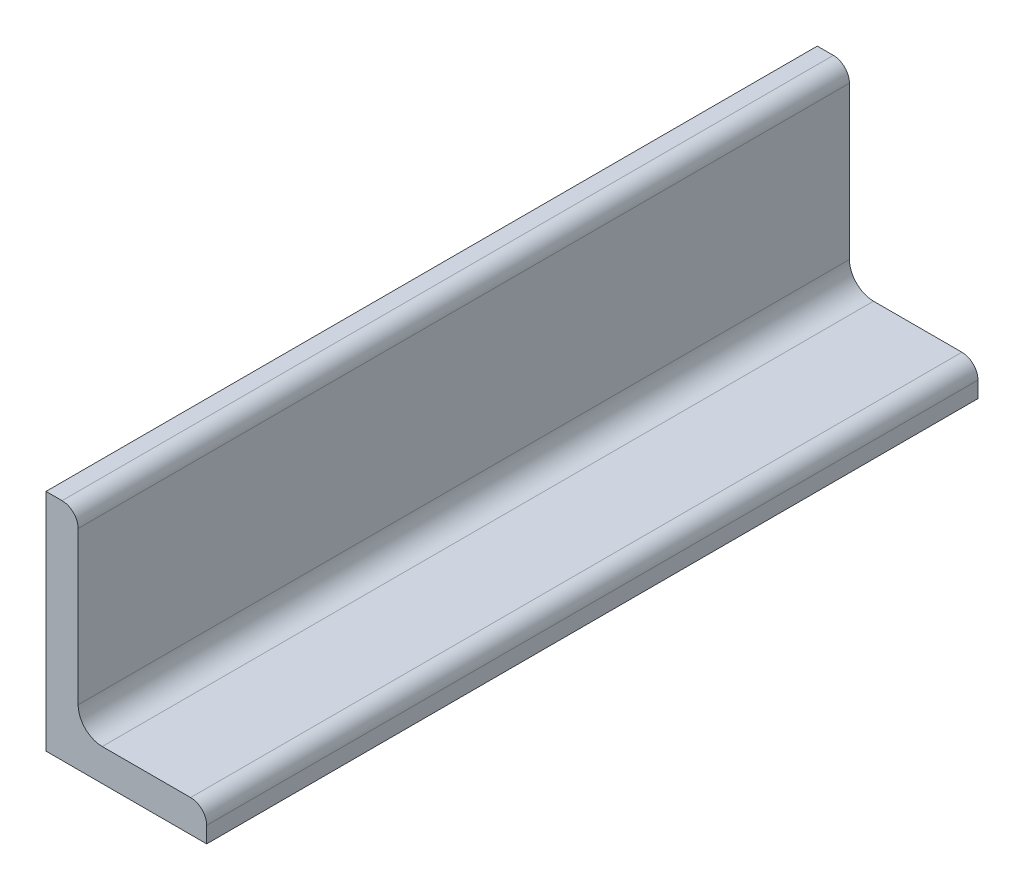
ISO-10303-21;
HEADER;
FILE_DESCRIPTION(('STEP AP214'),'2;1');
FILE_NAME('part.step','',(''),(''),'','','');
FILE_SCHEMA(('AUTOMOTIVE_DESIGN { 1 0 10303 214 1 1 1 1 }'));
ENDSEC;
DATA;
#1=APPLICATION_CONTEXT('core data for automotive mechanical design processes');
#2=APPLICATION_PROTOCOL_DEFINITION('international standard','automotive_design',2000,#1);
#3=PRODUCT_CONTEXT('',#1,'mechanical');
#4=PRODUCT('Part','Part','',(#3));
#5=PRODUCT_RELATED_PRODUCT_CATEGORY('part','',(#4));
#6=PRODUCT_DEFINITION_FORMATION('','',#4);
#7=PRODUCT_DEFINITION_CONTEXT('part definition',#1,'design');
#8=PRODUCT_DEFINITION('design','',#6,#7);
#9=PRODUCT_DEFINITION_SHAPE('','',#8);
#10=(LENGTH_UNIT() NAMED_UNIT(*) SI_UNIT(.MILLI.,.METRE.));
#11=(NAMED_UNIT(*) PLANE_ANGLE_UNIT() SI_UNIT($,.RADIAN.));
#12=(NAMED_UNIT(*) SI_UNIT($,.STERADIAN.) SOLID_ANGLE_UNIT());
#13=UNCERTAINTY_MEASURE_WITH_UNIT(LENGTH_MEASURE(1.E-05),#10,'distance_accuracy_value','');
#14=(GEOMETRIC_REPRESENTATION_CONTEXT(3) GLOBAL_UNCERTAINTY_ASSIGNED_CONTEXT((#13)) GLOBAL_UNIT_ASSIGNED_CONTEXT((#10,
#11,#12)) REPRESENTATION_CONTEXT('',''));
#15=CARTESIAN_POINT('',(0.,0.,0.));
#16=DIRECTION('',(0.,0.,1.));
#17=DIRECTION('',(1.,0.,0.));
#18=AXIS2_PLACEMENT_3D('',#15,#16,#17);
#19=CARTESIAN_POINT('',(0.897927251325018,89.7372005393545,304.8));
#20=DIRECTION('',(1.,0.,0.));
#21=DIRECTION('',(0.,0.,-1.));
#22=AXIS2_PLACEMENT_3D('',#19,#20,#21);
#23=PLANE('',#22);
#24=DIRECTION('',(0.,-1.,0.));
#25=VECTOR('',#24,1.);
#26=CARTESIAN_POINT('',(0.897927251325018,89.7372005393545,0.));
#27=LINE('',#26,#25);
#28=CARTESIAN_POINT('',(0.897927251325018,89.7372005393545,0.));
#29=VERTEX_POINT('',#28);
#30=CARTESIAN_POINT('',(0.897927251325018,0.837200539354535,0.));
#31=VERTEX_POINT('',#30);
#32=EDGE_CURVE('E135',#29,#31,#27,.T.);
#33=ORIENTED_EDGE('',*,*,#32,.T.);
#34=DIRECTION('',(0.,0.,-1.));
#35=VECTOR('',#34,1.);
#36=CARTESIAN_POINT('',(0.897927251325018,0.837200539354535,304.8));
#37=LINE('',#36,#35);
#38=CARTESIAN_POINT('',(0.897927251325018,0.837200539354535,304.8));
#39=VERTEX_POINT('',#38);
#40=EDGE_CURVE('E11',#39,#31,#37,.T.);
#41=ORIENTED_EDGE('',*,*,#40,.F.);
#42=DIRECTION('',(0.,-1.,0.));
#43=VECTOR('',#42,1.);
#44=CARTESIAN_POINT('',(0.897927251325018,89.7372005393545,304.8));
#45=LINE('',#44,#43);
#46=CARTESIAN_POINT('',(0.897927251325018,89.7372005393545,304.8));
#47=VERTEX_POINT('',#46);
#48=EDGE_CURVE('E151',#47,#39,#45,.T.);
#49=ORIENTED_EDGE('',*,*,#48,.F.);
#50=DIRECTION('',(0.,0.,-1.));
#51=VECTOR('',#50,1.);
#52=CARTESIAN_POINT('',(0.897927251325018,89.7372005393545,304.8));
#53=LINE('',#52,#51);
#54=EDGE_CURVE('E131',#47,#29,#53,.T.);
#55=ORIENTED_EDGE('',*,*,#54,.T.);
#56=EDGE_LOOP('',(#33,#41,#49,#55));
#57=FACE_BOUND('',#56,.T.);
#58=ADVANCED_FACE('F33',(#57),#23,.F.);
#59=CARTESIAN_POINT('',(0.897927251325018,0.837200539354535,304.8));
#60=DIRECTION('',(0.,1.,0.));
#61=DIRECTION('',(0.,0.,1.));
#62=AXIS2_PLACEMENT_3D('',#59,#60,#61);
#63=PLANE('',#62);
#64=DIRECTION('',(1.,0.,0.));
#65=VECTOR('',#64,1.);
#66=CARTESIAN_POINT('',(0.897927251325018,0.837200539354535,0.));
#67=LINE('',#66,#65);
#68=CARTESIAN_POINT('',(64.397927251325,0.837200539354535,0.));
#69=VERTEX_POINT('',#68);
#70=EDGE_CURVE('E138',#31,#69,#67,.T.);
#71=ORIENTED_EDGE('',*,*,#70,.T.);
#72=DIRECTION('',(0.,0.,-1.));
#73=VECTOR('',#72,1.);
#74=CARTESIAN_POINT('',(64.397927251325,0.837200539354535,304.8));
#75=LINE('',#74,#73);
#76=CARTESIAN_POINT('',(64.397927251325,0.837200539354535,304.8));
#77=VERTEX_POINT('',#76);
#78=EDGE_CURVE('E41',#77,#69,#75,.T.);
#79=ORIENTED_EDGE('',*,*,#78,.F.);
#80=DIRECTION('',(1.,0.,0.));
#81=VECTOR('',#80,1.);
#82=CARTESIAN_POINT('',(0.897927251325018,0.837200539354535,304.8));
#83=LINE('',#82,#81);
#84=EDGE_CURVE('E95',#39,#77,#83,.T.);
#85=ORIENTED_EDGE('',*,*,#84,.F.);
#86=ORIENTED_EDGE('',*,*,#40,.T.);
#87=EDGE_LOOP('',(#71,#79,#85,#86));
#88=FACE_BOUND('',#87,.T.);
#89=ADVANCED_FACE('F194',(#88),#63,.F.);
#90=CARTESIAN_POINT('',(64.397927251325,0.837200539354535,304.8));
#91=DIRECTION('',(-1.,0.,0.));
#92=DIRECTION('',(0.,0.,1.));
#93=AXIS2_PLACEMENT_3D('',#90,#91,#92);
#94=PLANE('',#93);
#95=DIRECTION('',(0.,1.,0.));
#96=VECTOR('',#95,1.);
#97=CARTESIAN_POINT('',(64.397927251325,0.837200539354535,0.));
#98=LINE('',#97,#96);
#99=CARTESIAN_POINT('',(64.397927251325,7.18720053935453,0.));
#100=VERTEX_POINT('',#99);
#101=EDGE_CURVE('E140',#69,#100,#98,.T.);
#102=ORIENTED_EDGE('',*,*,#101,.T.);
#103=DIRECTION('',(0.,0.,-1.));
#104=VECTOR('',#103,1.);
#105=CARTESIAN_POINT('',(64.397927251325,7.18720053935453,304.8));
#106=LINE('',#105,#104);
#107=CARTESIAN_POINT('',(64.397927251325,7.18720053935453,304.8));
#108=VERTEX_POINT('',#107);
#109=EDGE_CURVE('E161',#108,#100,#106,.T.);
#110=ORIENTED_EDGE('',*,*,#109,.F.);
#111=DIRECTION('',(0.,1.,0.));
#112=VECTOR('',#111,1.);
#113=CARTESIAN_POINT('',(64.397927251325,0.837200539354535,304.8));
#114=LINE('',#113,#112);
#115=EDGE_CURVE('E169',#77,#108,#114,.T.);
#116=ORIENTED_EDGE('',*,*,#115,.F.);
#117=ORIENTED_EDGE('',*,*,#78,.T.);
#118=EDGE_LOOP('',(#102,#110,#116,#117));
#119=FACE_BOUND('',#118,.T.);
#120=ADVANCED_FACE('F167',(#119),#94,.F.);
#121=CARTESIAN_POINT('',(58.047927251325,7.18720053935453,304.8));
#122=DIRECTION('',(0.,0.,-1.));
#123=DIRECTION('',(-1.,0.,0.));
#124=AXIS2_PLACEMENT_3D('',#121,#122,#123);
#125=CYLINDRICAL_SURFACE('',#124,6.35);
#126=CARTESIAN_POINT('',(58.047927251325,7.18720053935453,0.));
#127=DIRECTION('',(0.,0.,1.));
#128=DIRECTION('',(1.,0.,0.));
#129=AXIS2_PLACEMENT_3D('',#126,#127,#128);
#130=CIRCLE('',#129,6.35);
#131=CARTESIAN_POINT('',(58.047927251325,13.5372005393545,0.));
#132=VERTEX_POINT('',#131);
#133=EDGE_CURVE('E142',#100,#132,#130,.T.);
#134=ORIENTED_EDGE('',*,*,#133,.T.);
#135=DIRECTION('',(0.,0.,-1.));
#136=VECTOR('',#135,1.);
#137=CARTESIAN_POINT('',(58.047927251325,13.5372005393545,304.8));
#138=LINE('',#137,#136);
#139=CARTESIAN_POINT('',(58.047927251325,13.5372005393545,304.8));
#140=VERTEX_POINT('',#139);
#141=EDGE_CURVE('E158',#140,#132,#138,.T.);
#142=ORIENTED_EDGE('',*,*,#141,.F.);
#143=CARTESIAN_POINT('',(58.047927251325,7.18720053935453,304.8));
#144=DIRECTION('',(0.,0.,1.));
#145=DIRECTION('',(1.,0.,0.));
#146=AXIS2_PLACEMENT_3D('',#143,#144,#145);
#147=CIRCLE('',#146,6.35);
#148=EDGE_CURVE('E185',#108,#140,#147,.T.);
#149=ORIENTED_EDGE('',*,*,#148,.F.);
#150=ORIENTED_EDGE('',*,*,#109,.T.);
#151=EDGE_LOOP('',(#134,#142,#149,#150));
#152=FACE_BOUND('',#151,.T.);
#153=ADVANCED_FACE('F178',(#152),#125,.T.);
#154=CARTESIAN_POINT('',(58.047927251325,13.5372005393545,304.8));
#155=DIRECTION('',(0.,-1.,0.));
#156=DIRECTION('',(0.,0.,-1.));
#157=AXIS2_PLACEMENT_3D('',#154,#155,#156);
#158=PLANE('',#157);
#159=DIRECTION('',(-1.,0.,0.));
#160=VECTOR('',#159,1.);
#161=CARTESIAN_POINT('',(58.047927251325,13.5372005393545,0.));
#162=LINE('',#161,#160);
#163=CARTESIAN_POINT('',(23.122927251325,13.5372005393545,0.));
#164=VERTEX_POINT('',#163);
#165=EDGE_CURVE('E144',#132,#164,#162,.T.);
#166=ORIENTED_EDGE('',*,*,#165,.T.);
#167=DIRECTION('',(0.,0.,-1.));
#168=VECTOR('',#167,1.);
#169=CARTESIAN_POINT('',(23.122927251325,13.5372005393545,304.8));
#170=LINE('',#169,#168);
#171=CARTESIAN_POINT('',(23.122927251325,13.5372005393545,304.8));
#172=VERTEX_POINT('',#171);
#173=EDGE_CURVE('E155',#172,#164,#170,.T.);
#174=ORIENTED_EDGE('',*,*,#173,.F.);
#175=DIRECTION('',(-1.,0.,0.));
#176=VECTOR('',#175,1.);
#177=CARTESIAN_POINT('',(58.047927251325,13.5372005393545,304.8));
#178=LINE('',#177,#176);
#179=EDGE_CURVE('E184',#140,#172,#178,.T.);
#180=ORIENTED_EDGE('',*,*,#179,.F.);
#181=ORIENTED_EDGE('',*,*,#141,.T.);
#182=EDGE_LOOP('',(#166,#174,#180,#181));
#183=FACE_BOUND('',#182,.T.);
#184=ADVANCED_FACE('F182',(#183),#158,.F.);
#185=CARTESIAN_POINT('',(23.122927251325,23.0622005393545,304.8));
#186=DIRECTION('',(0.,0.,-1.));
#187=DIRECTION('',(-1.,0.,0.));
#188=AXIS2_PLACEMENT_3D('',#185,#186,#187);
#189=CYLINDRICAL_SURFACE('',#188,9.52499999999999);
#190=CARTESIAN_POINT('',(23.122927251325,23.0622005393545,0.));
#191=DIRECTION('',(0.,0.,-1.));
#192=DIRECTION('',(1.,0.,0.));
#193=AXIS2_PLACEMENT_3D('',#190,#191,#192);
#194=CIRCLE('',#193,9.52499999999999);
#195=CARTESIAN_POINT('',(13.597927251325,23.0622005393545,0.));
#196=VERTEX_POINT('',#195);
#197=EDGE_CURVE('E146',#164,#196,#194,.T.);
#198=ORIENTED_EDGE('',*,*,#197,.T.);
#199=DIRECTION('',(0.,0.,-1.));
#200=VECTOR('',#199,1.);
#201=CARTESIAN_POINT('',(13.597927251325,23.0622005393545,304.8));
#202=LINE('',#201,#200);
#203=CARTESIAN_POINT('',(13.597927251325,23.0622005393545,304.8));
#204=VERTEX_POINT('',#203);
#205=EDGE_CURVE('E126',#204,#196,#202,.T.);
#206=ORIENTED_EDGE('',*,*,#205,.F.);
#207=CARTESIAN_POINT('',(23.122927251325,23.0622005393545,304.8));
#208=DIRECTION('',(0.,0.,-1.));
#209=DIRECTION('',(1.,0.,0.));
#210=AXIS2_PLACEMENT_3D('',#207,#208,#209);
#211=CIRCLE('',#210,9.52499999999999);
#212=EDGE_CURVE('E117',#172,#204,#211,.T.);
#213=ORIENTED_EDGE('',*,*,#212,.F.);
#214=ORIENTED_EDGE('',*,*,#173,.T.);
#215=EDGE_LOOP('',(#198,#206,#213,#214));
#216=FACE_BOUND('',#215,.T.);
#217=ADVANCED_FACE('F206',(#216),#189,.F.);
#218=CARTESIAN_POINT('',(13.597927251325,23.0622005393545,304.8));
#219=DIRECTION('',(-1.,0.,0.));
#220=DIRECTION('',(0.,0.,1.));
#221=AXIS2_PLACEMENT_3D('',#218,#219,#220);
#222=PLANE('',#221);
#223=DIRECTION('',(0.,1.,0.));
#224=VECTOR('',#223,1.);
#225=CARTESIAN_POINT('',(13.597927251325,23.0622005393545,0.));
#226=LINE('',#225,#224);
#227=CARTESIAN_POINT('',(13.597927251325,83.3872005393545,0.));
#228=VERTEX_POINT('',#227);
#229=EDGE_CURVE('E125',#196,#228,#226,.T.);
#230=ORIENTED_EDGE('',*,*,#229,.T.);
#231=DIRECTION('',(0.,0.,-1.));
#232=VECTOR('',#231,1.);
#233=CARTESIAN_POINT('',(13.597927251325,83.3872005393545,304.8));
#234=LINE('',#233,#232);
#235=CARTESIAN_POINT('',(13.597927251325,83.3872005393545,304.8));
#236=VERTEX_POINT('',#235);
#237=EDGE_CURVE('E122',#236,#228,#234,.T.);
#238=ORIENTED_EDGE('',*,*,#237,.F.);
#239=DIRECTION('',(0.,1.,0.));
#240=VECTOR('',#239,1.);
#241=CARTESIAN_POINT('',(13.597927251325,23.0622005393545,304.8));
#242=LINE('',#241,#240);
#243=EDGE_CURVE('E111',#204,#236,#242,.T.);
#244=ORIENTED_EDGE('',*,*,#243,.F.);
#245=ORIENTED_EDGE('',*,*,#205,.T.);
#246=EDGE_LOOP('',(#230,#238,#244,#245));
#247=FACE_BOUND('',#246,.T.);
#248=ADVANCED_FACE('F123',(#247),#222,.F.);
#249=CARTESIAN_POINT('',(7.24792725132502,83.3872005393545,304.8));
#250=DIRECTION('',(0.,0.,-1.));
#251=DIRECTION('',(-1.,0.,0.));
#252=AXIS2_PLACEMENT_3D('',#249,#250,#251);
#253=CYLINDRICAL_SURFACE('',#252,6.35);
#254=CARTESIAN_POINT('',(7.24792725132502,83.3872005393545,0.));
#255=DIRECTION('',(0.,0.,1.));
#256=DIRECTION('',(1.,0.,0.));
#257=AXIS2_PLACEMENT_3D('',#254,#255,#256);
#258=CIRCLE('',#257,6.35);
#259=CARTESIAN_POINT('',(7.24792725132502,89.7372005393545,0.));
#260=VERTEX_POINT('',#259);
#261=EDGE_CURVE('E81',#228,#260,#258,.T.);
#262=ORIENTED_EDGE('',*,*,#261,.T.);
#263=DIRECTION('',(0.,0.,-1.));
#264=VECTOR('',#263,1.);
#265=CARTESIAN_POINT('',(7.24792725132502,89.7372005393545,304.8));
#266=LINE('',#265,#264);
#267=CARTESIAN_POINT('',(7.24792725132502,89.7372005393545,304.8));
#268=VERTEX_POINT('',#267);
#269=EDGE_CURVE('E127',#268,#260,#266,.T.);
#270=ORIENTED_EDGE('',*,*,#269,.F.);
#271=CARTESIAN_POINT('',(7.24792725132502,83.3872005393545,304.8));
#272=DIRECTION('',(0.,0.,1.));
#273=DIRECTION('',(1.,0.,0.));
#274=AXIS2_PLACEMENT_3D('',#271,#272,#273);
#275=CIRCLE('',#274,6.35);
#276=EDGE_CURVE('E115',#236,#268,#275,.T.);
#277=ORIENTED_EDGE('',*,*,#276,.F.);
#278=ORIENTED_EDGE('',*,*,#237,.T.);
#279=EDGE_LOOP('',(#262,#270,#277,#278));
#280=FACE_BOUND('',#279,.T.);
#281=ADVANCED_FACE('F129',(#280),#253,.T.);
#282=CARTESIAN_POINT('',(7.24792725132502,89.7372005393545,304.8));
#283=DIRECTION('',(0.,-1.,0.));
#284=DIRECTION('',(0.,0.,-1.));
#285=AXIS2_PLACEMENT_3D('',#282,#283,#284);
#286=PLANE('',#285);
#287=DIRECTION('',(-1.,0.,0.));
#288=VECTOR('',#287,1.);
#289=CARTESIAN_POINT('',(7.24792725132502,89.7372005393545,0.));
#290=LINE('',#289,#288);
#291=EDGE_CURVE('E87',#260,#29,#290,.T.);
#292=ORIENTED_EDGE('',*,*,#291,.T.);
#293=ORIENTED_EDGE('',*,*,#54,.F.);
#294=DIRECTION('',(-1.,0.,0.));
#295=VECTOR('',#294,1.);
#296=CARTESIAN_POINT('',(7.24792725132502,89.7372005393545,304.8));
#297=LINE('',#296,#295);
#298=EDGE_CURVE('E49',#268,#47,#297,.T.);
#299=ORIENTED_EDGE('',*,*,#298,.F.);
#300=ORIENTED_EDGE('',*,*,#269,.T.);
#301=EDGE_LOOP('',(#292,#293,#299,#300));
#302=FACE_BOUND('',#301,.T.);
#303=ADVANCED_FACE('F214',(#302),#286,.F.);
#304=CARTESIAN_POINT('',(58.047927251325,7.18720053935453,304.8));
#305=DIRECTION('',(0.,0.,1.));
#306=DIRECTION('',(1.,0.,0.));
#307=AXIS2_PLACEMENT_3D('',#304,#305,#306);
#308=PLANE('',#307);
#309=ORIENTED_EDGE('',*,*,#48,.T.);
#310=ORIENTED_EDGE('',*,*,#84,.T.);
#311=ORIENTED_EDGE('',*,*,#115,.T.);
#312=ORIENTED_EDGE('',*,*,#148,.T.);
#313=ORIENTED_EDGE('',*,*,#179,.T.);
#314=ORIENTED_EDGE('',*,*,#212,.T.);
#315=ORIENTED_EDGE('',*,*,#243,.T.);
#316=ORIENTED_EDGE('',*,*,#276,.T.);
#317=ORIENTED_EDGE('',*,*,#298,.T.);
#318=EDGE_LOOP('',(#309,#310,#311,#312,#313,#314,#315,#316,#317));
#319=FACE_BOUND('',#318,.T.);
#320=ADVANCED_FACE('F113',(#319),#308,.T.);
#321=CARTESIAN_POINT('',(58.047927251325,7.18720053935453,0.));
#322=DIRECTION('',(0.,0.,1.));
#323=DIRECTION('',(1.,0.,0.));
#324=AXIS2_PLACEMENT_3D('',#321,#322,#323);
#325=PLANE('',#324);
#326=ORIENTED_EDGE('',*,*,#32,.F.);
#327=ORIENTED_EDGE('',*,*,#291,.F.);
#328=ORIENTED_EDGE('',*,*,#261,.F.);
#329=ORIENTED_EDGE('',*,*,#229,.F.);
#330=ORIENTED_EDGE('',*,*,#197,.F.);
#331=ORIENTED_EDGE('',*,*,#165,.F.);
#332=ORIENTED_EDGE('',*,*,#133,.F.);
#333=ORIENTED_EDGE('',*,*,#101,.F.);
#334=ORIENTED_EDGE('',*,*,#70,.F.);
#335=EDGE_LOOP('',(#326,#327,#328,#329,#330,#331,#332,#333,#334));
#336=FACE_BOUND('',#335,.T.);
#337=ADVANCED_FACE('F173',(#336),#325,.F.);
#338=CLOSED_SHELL('',(#58,#89,#120,#153,#184,#217,#248,#281,#303,#320,#337));
#339=MANIFOLD_SOLID_BREP('B2',#338);
#340=ADVANCED_BREP_SHAPE_REPRESENTATION('',(#18,#339),#14);
#341=SHAPE_DEFINITION_REPRESENTATION(#9,#340);
ENDSEC;
END-ISO-10303-21;
